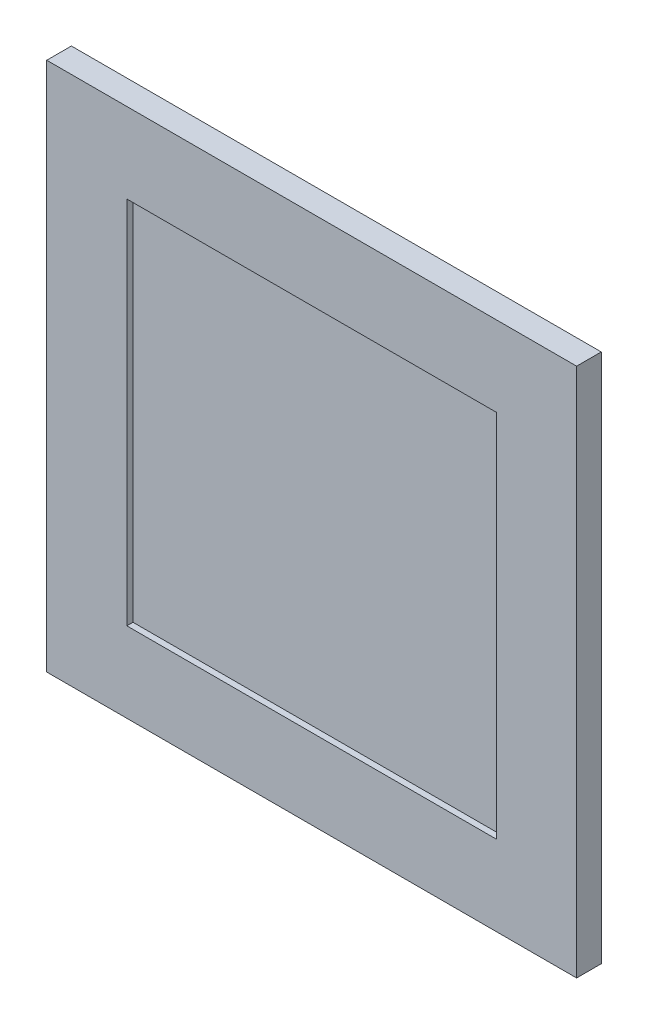
ISO-10303-21;
HEADER;
FILE_DESCRIPTION(('STEP AP214'),'2;1');
FILE_NAME('part.step','',(''),(''),'','','');
FILE_SCHEMA(('AUTOMOTIVE_DESIGN { 1 0 10303 214 1 1 1 1 }'));
ENDSEC;
DATA;
#1=APPLICATION_CONTEXT('core data for automotive mechanical design processes');
#2=APPLICATION_PROTOCOL_DEFINITION('international standard','automotive_design',2000,#1);
#3=PRODUCT_CONTEXT('',#1,'mechanical');
#4=PRODUCT('Part','Part','',(#3));
#5=PRODUCT_RELATED_PRODUCT_CATEGORY('part','',(#4));
#6=PRODUCT_DEFINITION_FORMATION('','',#4);
#7=PRODUCT_DEFINITION_CONTEXT('part definition',#1,'design');
#8=PRODUCT_DEFINITION('design','',#6,#7);
#9=PRODUCT_DEFINITION_SHAPE('','',#8);
#10=(LENGTH_UNIT() NAMED_UNIT(*) SI_UNIT(.MILLI.,.METRE.));
#11=(NAMED_UNIT(*) PLANE_ANGLE_UNIT() SI_UNIT($,.RADIAN.));
#12=(NAMED_UNIT(*) SI_UNIT($,.STERADIAN.) SOLID_ANGLE_UNIT());
#13=UNCERTAINTY_MEASURE_WITH_UNIT(LENGTH_MEASURE(1.E-05),#10,'distance_accuracy_value','');
#14=(GEOMETRIC_REPRESENTATION_CONTEXT(3) GLOBAL_UNCERTAINTY_ASSIGNED_CONTEXT((#13)) GLOBAL_UNIT_ASSIGNED_CONTEXT((#10,
#11,#12)) REPRESENTATION_CONTEXT('',''));
#15=CARTESIAN_POINT('',(0.,0.,0.));
#16=DIRECTION('',(0.,0.,1.));
#17=DIRECTION('',(1.,0.,0.));
#18=AXIS2_PLACEMENT_3D('',#15,#16,#17);
#19=CARTESIAN_POINT('',(215.,215.,20.));
#20=DIRECTION('',(-1.,0.,0.));
#21=DIRECTION('',(0.,-1.,0.));
#22=AXIS2_PLACEMENT_3D('',#19,#20,#21);
#23=PLANE('',#22);
#24=DIRECTION('',(0.,1.,0.));
#25=VECTOR('',#24,1.);
#26=CARTESIAN_POINT('',(215.,215.,0.));
#27=LINE('',#26,#25);
#28=CARTESIAN_POINT('',(215.,-215.,0.));
#29=VERTEX_POINT('',#28);
#30=CARTESIAN_POINT('',(215.,215.,0.));
#31=VERTEX_POINT('',#30);
#32=EDGE_CURVE('E162',#29,#31,#27,.T.);
#33=ORIENTED_EDGE('',*,*,#32,.T.);
#34=DIRECTION('',(0.,0.,-1.));
#35=VECTOR('',#34,1.);
#36=CARTESIAN_POINT('',(215.,215.,20.));
#37=LINE('',#36,#35);
#38=CARTESIAN_POINT('',(215.,215.,20.));
#39=VERTEX_POINT('',#38);
#40=EDGE_CURVE('E11',#39,#31,#37,.T.);
#41=ORIENTED_EDGE('',*,*,#40,.F.);
#42=DIRECTION('',(0.,1.,0.));
#43=VECTOR('',#42,1.);
#44=CARTESIAN_POINT('',(215.,215.,20.));
#45=LINE('',#44,#43);
#46=CARTESIAN_POINT('',(215.,-215.,20.));
#47=VERTEX_POINT('',#46);
#48=EDGE_CURVE('E168',#47,#39,#45,.T.);
#49=ORIENTED_EDGE('',*,*,#48,.F.);
#50=DIRECTION('',(0.,0.,-1.));
#51=VECTOR('',#50,1.);
#52=CARTESIAN_POINT('',(215.,-215.,20.));
#53=LINE('',#52,#51);
#54=EDGE_CURVE('E178',#47,#29,#53,.T.);
#55=ORIENTED_EDGE('',*,*,#54,.T.);
#56=EDGE_LOOP('',(#33,#41,#49,#55));
#57=FACE_BOUND('',#56,.T.);
#58=ADVANCED_FACE('F43',(#57),#23,.F.);
#59=CARTESIAN_POINT('',(-215.,215.,20.));
#60=DIRECTION('',(0.,-1.,0.));
#61=DIRECTION('',(0.,0.,-1.));
#62=AXIS2_PLACEMENT_3D('',#59,#60,#61);
#63=PLANE('',#62);
#64=DIRECTION('',(-1.,0.,0.));
#65=VECTOR('',#64,1.);
#66=CARTESIAN_POINT('',(-215.,215.,0.));
#67=LINE('',#66,#65);
#68=CARTESIAN_POINT('',(-215.,215.,0.));
#69=VERTEX_POINT('',#68);
#70=EDGE_CURVE('E182',#31,#69,#67,.T.);
#71=ORIENTED_EDGE('',*,*,#70,.T.);
#72=DIRECTION('',(0.,0.,-1.));
#73=VECTOR('',#72,1.);
#74=CARTESIAN_POINT('',(-215.,215.,20.));
#75=LINE('',#74,#73);
#76=CARTESIAN_POINT('',(-215.,215.,20.));
#77=VERTEX_POINT('',#76);
#78=EDGE_CURVE('E51',#77,#69,#75,.T.);
#79=ORIENTED_EDGE('',*,*,#78,.F.);
#80=DIRECTION('',(-1.,0.,0.));
#81=VECTOR('',#80,1.);
#82=CARTESIAN_POINT('',(-215.,215.,20.));
#83=LINE('',#82,#81);
#84=EDGE_CURVE('E95',#39,#77,#83,.T.);
#85=ORIENTED_EDGE('',*,*,#84,.F.);
#86=ORIENTED_EDGE('',*,*,#40,.T.);
#87=EDGE_LOOP('',(#71,#79,#85,#86));
#88=FACE_BOUND('',#87,.T.);
#89=ADVANCED_FACE('F217',(#88),#63,.F.);
#90=CARTESIAN_POINT('',(-215.,215.,20.));
#91=DIRECTION('',(1.,0.,0.));
#92=DIRECTION('',(0.,1.,0.));
#93=AXIS2_PLACEMENT_3D('',#90,#91,#92);
#94=PLANE('',#93);
#95=DIRECTION('',(0.,-1.,0.));
#96=VECTOR('',#95,1.);
#97=CARTESIAN_POINT('',(-215.,215.,0.));
#98=LINE('',#97,#96);
#99=CARTESIAN_POINT('',(-215.,-215.,0.));
#100=VERTEX_POINT('',#99);
#101=EDGE_CURVE('E185',#69,#100,#98,.T.);
#102=ORIENTED_EDGE('',*,*,#101,.T.);
#103=DIRECTION('',(0.,0.,-1.));
#104=VECTOR('',#103,1.);
#105=CARTESIAN_POINT('',(-215.,-215.,20.));
#106=LINE('',#105,#104);
#107=CARTESIAN_POINT('',(-215.,-215.,20.));
#108=VERTEX_POINT('',#107);
#109=EDGE_CURVE('E192',#108,#100,#106,.T.);
#110=ORIENTED_EDGE('',*,*,#109,.F.);
#111=DIRECTION('',(0.,-1.,0.));
#112=VECTOR('',#111,1.);
#113=CARTESIAN_POINT('',(-215.,215.,20.));
#114=LINE('',#113,#112);
#115=EDGE_CURVE('E173',#77,#108,#114,.T.);
#116=ORIENTED_EDGE('',*,*,#115,.F.);
#117=ORIENTED_EDGE('',*,*,#78,.T.);
#118=EDGE_LOOP('',(#102,#110,#116,#117));
#119=FACE_BOUND('',#118,.T.);
#120=ADVANCED_FACE('F199',(#119),#94,.F.);
#121=CARTESIAN_POINT('',(-215.,-215.,20.));
#122=DIRECTION('',(0.,1.,0.));
#123=DIRECTION('',(0.,0.,1.));
#124=AXIS2_PLACEMENT_3D('',#121,#122,#123);
#125=PLANE('',#124);
#126=DIRECTION('',(1.,0.,0.));
#127=VECTOR('',#126,1.);
#128=CARTESIAN_POINT('',(-215.,-215.,0.));
#129=LINE('',#128,#127);
#130=EDGE_CURVE('E88',#100,#29,#129,.T.);
#131=ORIENTED_EDGE('',*,*,#130,.T.);
#132=ORIENTED_EDGE('',*,*,#54,.F.);
#133=DIRECTION('',(1.,0.,0.));
#134=VECTOR('',#133,1.);
#135=CARTESIAN_POINT('',(-215.,-215.,20.));
#136=LINE('',#135,#134);
#137=EDGE_CURVE('E67',#108,#47,#136,.T.);
#138=ORIENTED_EDGE('',*,*,#137,.F.);
#139=ORIENTED_EDGE('',*,*,#109,.T.);
#140=EDGE_LOOP('',(#131,#132,#138,#139));
#141=FACE_BOUND('',#140,.T.);
#142=ADVANCED_FACE('F207',(#141),#125,.F.);
#143=CARTESIAN_POINT('',(0.,0.,20.));
#144=DIRECTION('',(0.,0.,1.));
#145=DIRECTION('',(1.,0.,0.));
#146=AXIS2_PLACEMENT_3D('',#143,#144,#145);
#147=PLANE('',#146);
#148=DIRECTION('',(0.,1.,0.));
#149=VECTOR('',#148,1.);
#150=CARTESIAN_POINT('',(150.,150.,20.));
#151=LINE('',#150,#149);
#152=CARTESIAN_POINT('',(150.,-150.,20.));
#153=VERTEX_POINT('',#152);
#154=CARTESIAN_POINT('',(150.,150.,20.));
#155=VERTEX_POINT('',#154);
#156=EDGE_CURVE('E58',#153,#155,#151,.T.);
#157=ORIENTED_EDGE('',*,*,#156,.F.);
#158=DIRECTION('',(1.,0.,0.));
#159=VECTOR('',#158,1.);
#160=CARTESIAN_POINT('',(-150.,-150.,20.));
#161=LINE('',#160,#159);
#162=CARTESIAN_POINT('',(-150.,-150.,20.));
#163=VERTEX_POINT('',#162);
#164=EDGE_CURVE('E140',#163,#153,#161,.T.);
#165=ORIENTED_EDGE('',*,*,#164,.F.);
#166=DIRECTION('',(0.,-1.,0.));
#167=VECTOR('',#166,1.);
#168=CARTESIAN_POINT('',(-150.,150.,20.));
#169=LINE('',#168,#167);
#170=CARTESIAN_POINT('',(-150.,150.,20.));
#171=VERTEX_POINT('',#170);
#172=EDGE_CURVE('E144',#171,#163,#169,.T.);
#173=ORIENTED_EDGE('',*,*,#172,.F.);
#174=DIRECTION('',(-1.,0.,0.));
#175=VECTOR('',#174,1.);
#176=CARTESIAN_POINT('',(-150.,150.,20.));
#177=LINE('',#176,#175);
#178=EDGE_CURVE('E153',#155,#171,#177,.T.);
#179=ORIENTED_EDGE('',*,*,#178,.F.);
#180=EDGE_LOOP('',(#157,#165,#173,#179));
#181=FACE_BOUND('',#180,.T.);
#182=ORIENTED_EDGE('',*,*,#48,.T.);
#183=ORIENTED_EDGE('',*,*,#84,.T.);
#184=ORIENTED_EDGE('',*,*,#115,.T.);
#185=ORIENTED_EDGE('',*,*,#137,.T.);
#186=EDGE_LOOP('',(#182,#183,#184,#185));
#187=FACE_BOUND('',#186,.T.);
#188=ADVANCED_FACE('F209',(#181,#187),#147,.T.);
#189=CARTESIAN_POINT('',(0.,0.,0.));
#190=DIRECTION('',(0.,0.,1.));
#191=DIRECTION('',(1.,0.,0.));
#192=AXIS2_PLACEMENT_3D('',#189,#190,#191);
#193=PLANE('',#192);
#194=ORIENTED_EDGE('',*,*,#32,.F.);
#195=ORIENTED_EDGE('',*,*,#130,.F.);
#196=ORIENTED_EDGE('',*,*,#101,.F.);
#197=ORIENTED_EDGE('',*,*,#70,.F.);
#198=EDGE_LOOP('',(#194,#195,#196,#197));
#199=FACE_BOUND('',#198,.T.);
#200=ADVANCED_FACE('F203',(#199),#193,.F.);
#201=CARTESIAN_POINT('',(150.,150.,15.));
#202=DIRECTION('',(1.,0.,0.));
#203=DIRECTION('',(0.,0.,-1.));
#204=AXIS2_PLACEMENT_3D('',#201,#202,#203);
#205=PLANE('',#204);
#206=ORIENTED_EDGE('',*,*,#156,.T.);
#207=DIRECTION('',(0.,0.,1.));
#208=VECTOR('',#207,1.);
#209=CARTESIAN_POINT('',(150.,150.,15.));
#210=LINE('',#209,#208);
#211=CARTESIAN_POINT('',(150.,150.,15.));
#212=VERTEX_POINT('',#211);
#213=EDGE_CURVE('E115',#212,#155,#210,.T.);
#214=ORIENTED_EDGE('',*,*,#213,.F.);
#215=DIRECTION('',(0.,1.,0.));
#216=VECTOR('',#215,1.);
#217=CARTESIAN_POINT('',(150.,150.,15.));
#218=LINE('',#217,#216);
#219=CARTESIAN_POINT('',(150.,-150.,15.));
#220=VERTEX_POINT('',#219);
#221=EDGE_CURVE('E119',#220,#212,#218,.T.);
#222=ORIENTED_EDGE('',*,*,#221,.F.);
#223=DIRECTION('',(0.,0.,1.));
#224=VECTOR('',#223,1.);
#225=CARTESIAN_POINT('',(150.,-150.,15.));
#226=LINE('',#225,#224);
#227=EDGE_CURVE('E159',#220,#153,#226,.T.);
#228=ORIENTED_EDGE('',*,*,#227,.T.);
#229=EDGE_LOOP('',(#206,#214,#222,#228));
#230=FACE_BOUND('',#229,.T.);
#231=ADVANCED_FACE('F117',(#230),#205,.F.);
#232=CARTESIAN_POINT('',(-150.,-150.,15.));
#233=DIRECTION('',(0.,-1.,0.));
#234=DIRECTION('',(0.,0.,-1.));
#235=AXIS2_PLACEMENT_3D('',#232,#233,#234);
#236=PLANE('',#235);
#237=ORIENTED_EDGE('',*,*,#164,.T.);
#238=ORIENTED_EDGE('',*,*,#227,.F.);
#239=DIRECTION('',(1.,0.,0.));
#240=VECTOR('',#239,1.);
#241=CARTESIAN_POINT('',(-150.,-150.,15.));
#242=LINE('',#241,#240);
#243=CARTESIAN_POINT('',(-150.,-150.,15.));
#244=VERTEX_POINT('',#243);
#245=EDGE_CURVE('E126',#244,#220,#242,.T.);
#246=ORIENTED_EDGE('',*,*,#245,.F.);
#247=DIRECTION('',(0.,0.,1.));
#248=VECTOR('',#247,1.);
#249=CARTESIAN_POINT('',(-150.,-150.,15.));
#250=LINE('',#249,#248);
#251=EDGE_CURVE('E163',#244,#163,#250,.T.);
#252=ORIENTED_EDGE('',*,*,#251,.T.);
#253=EDGE_LOOP('',(#237,#238,#246,#252));
#254=FACE_BOUND('',#253,.T.);
#255=ADVANCED_FACE('F260',(#254),#236,.F.);
#256=CARTESIAN_POINT('',(-150.,150.,15.));
#257=DIRECTION('',(-1.,0.,0.));
#258=DIRECTION('',(0.,0.,1.));
#259=AXIS2_PLACEMENT_3D('',#256,#257,#258);
#260=PLANE('',#259);
#261=ORIENTED_EDGE('',*,*,#172,.T.);
#262=ORIENTED_EDGE('',*,*,#251,.F.);
#263=DIRECTION('',(0.,-1.,0.));
#264=VECTOR('',#263,1.);
#265=CARTESIAN_POINT('',(-150.,150.,15.));
#266=LINE('',#265,#264);
#267=CARTESIAN_POINT('',(-150.,150.,15.));
#268=VERTEX_POINT('',#267);
#269=EDGE_CURVE('E135',#268,#244,#266,.T.);
#270=ORIENTED_EDGE('',*,*,#269,.F.);
#271=DIRECTION('',(0.,0.,1.));
#272=VECTOR('',#271,1.);
#273=CARTESIAN_POINT('',(-150.,150.,15.));
#274=LINE('',#273,#272);
#275=EDGE_CURVE('E125',#268,#171,#274,.T.);
#276=ORIENTED_EDGE('',*,*,#275,.T.);
#277=EDGE_LOOP('',(#261,#262,#270,#276));
#278=FACE_BOUND('',#277,.T.);
#279=ADVANCED_FACE('F270',(#278),#260,.F.);
#280=CARTESIAN_POINT('',(-150.,150.,15.));
#281=DIRECTION('',(0.,1.,0.));
#282=DIRECTION('',(0.,0.,1.));
#283=AXIS2_PLACEMENT_3D('',#280,#281,#282);
#284=PLANE('',#283);
#285=ORIENTED_EDGE('',*,*,#178,.T.);
#286=ORIENTED_EDGE('',*,*,#275,.F.);
#287=DIRECTION('',(-1.,0.,0.));
#288=VECTOR('',#287,1.);
#289=CARTESIAN_POINT('',(-150.,150.,15.));
#290=LINE('',#289,#288);
#291=EDGE_CURVE('E129',#212,#268,#290,.T.);
#292=ORIENTED_EDGE('',*,*,#291,.F.);
#293=ORIENTED_EDGE('',*,*,#213,.T.);
#294=EDGE_LOOP('',(#285,#286,#292,#293));
#295=FACE_BOUND('',#294,.T.);
#296=ADVANCED_FACE('F130',(#295),#284,.F.);
#297=CARTESIAN_POINT('',(0.,0.,15.));
#298=DIRECTION('',(0.,0.,1.));
#299=DIRECTION('',(1.,0.,0.));
#300=AXIS2_PLACEMENT_3D('',#297,#298,#299);
#301=PLANE('',#300);
#302=ORIENTED_EDGE('',*,*,#221,.T.);
#303=ORIENTED_EDGE('',*,*,#291,.T.);
#304=ORIENTED_EDGE('',*,*,#269,.T.);
#305=ORIENTED_EDGE('',*,*,#245,.T.);
#306=EDGE_LOOP('',(#302,#303,#304,#305));
#307=FACE_BOUND('',#306,.T.);
#308=ADVANCED_FACE('F137',(#307),#301,.T.);
#309=CLOSED_SHELL('',(#58,#89,#120,#142,#188,#200,#231,#255,#279,#296,#308));
#310=MANIFOLD_SOLID_BREP('B2',#309);
#311=ADVANCED_BREP_SHAPE_REPRESENTATION('',(#18,#310),#14);
#312=SHAPE_DEFINITION_REPRESENTATION(#9,#311);
ENDSEC;
END-ISO-10303-21;
